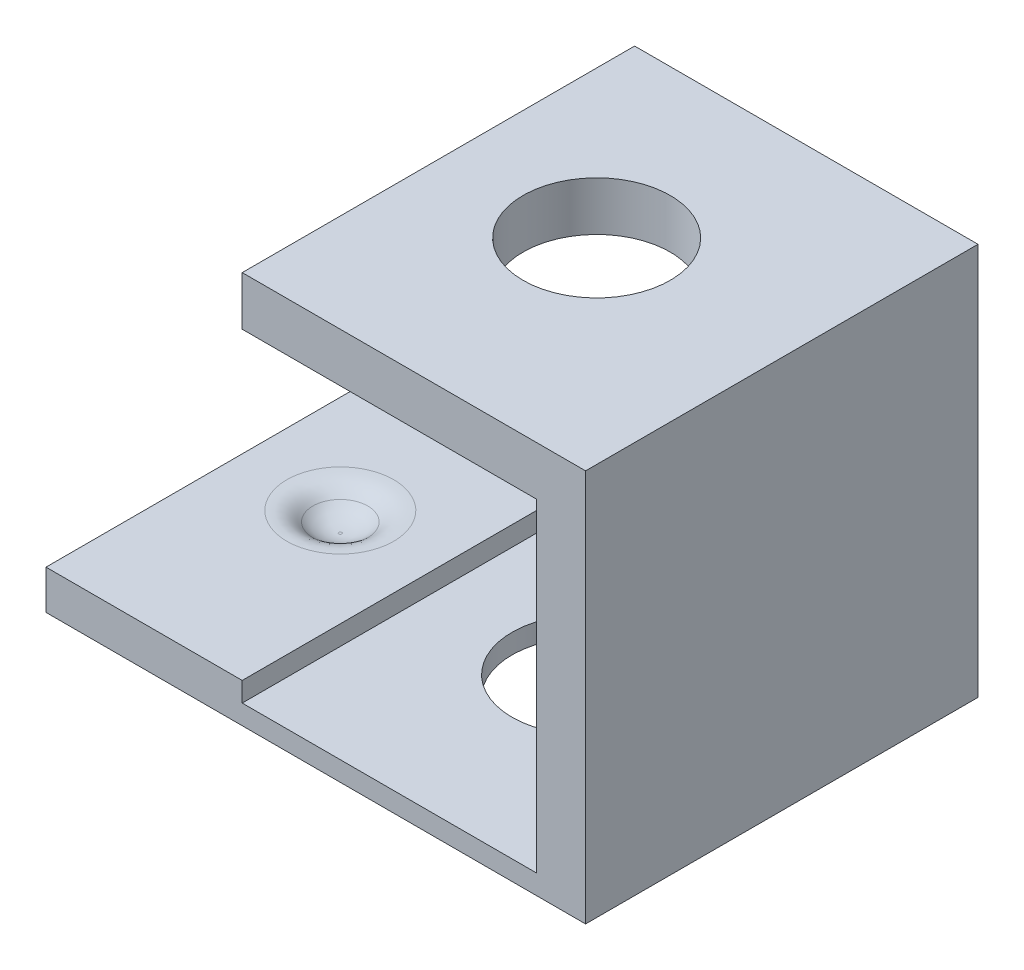
ISO-10303-21;
HEADER;
FILE_DESCRIPTION(('STEP AP214'),'2;1');
FILE_NAME('part.step','',(''),(''),'','','');
FILE_SCHEMA(('AUTOMOTIVE_DESIGN { 1 0 10303 214 1 1 1 1 }'));
ENDSEC;
DATA;
#1=APPLICATION_CONTEXT('core data for automotive mechanical design processes');
#2=APPLICATION_PROTOCOL_DEFINITION('international standard','automotive_design',2000,#1);
#3=PRODUCT_CONTEXT('',#1,'mechanical');
#4=PRODUCT('Part','Part','',(#3));
#5=PRODUCT_RELATED_PRODUCT_CATEGORY('part','',(#4));
#6=PRODUCT_DEFINITION_FORMATION('','',#4);
#7=PRODUCT_DEFINITION_CONTEXT('part definition',#1,'design');
#8=PRODUCT_DEFINITION('design','',#6,#7);
#9=PRODUCT_DEFINITION_SHAPE('','',#8);
#10=(LENGTH_UNIT() NAMED_UNIT(*) SI_UNIT(.MILLI.,.METRE.));
#11=(NAMED_UNIT(*) PLANE_ANGLE_UNIT() SI_UNIT($,.RADIAN.));
#12=(NAMED_UNIT(*) SI_UNIT($,.STERADIAN.) SOLID_ANGLE_UNIT());
#13=UNCERTAINTY_MEASURE_WITH_UNIT(LENGTH_MEASURE(1.E-05),#10,'distance_accuracy_value','');
#14=(GEOMETRIC_REPRESENTATION_CONTEXT(3) GLOBAL_UNCERTAINTY_ASSIGNED_CONTEXT((#13)) GLOBAL_UNIT_ASSIGNED_CONTEXT((#10,
#11,#12)) REPRESENTATION_CONTEXT('',''));
#15=CARTESIAN_POINT('',(0.,0.,0.));
#16=DIRECTION('',(0.,0.,1.));
#17=DIRECTION('',(1.,0.,0.));
#18=AXIS2_PLACEMENT_3D('',#15,#16,#17);
#19=CARTESIAN_POINT('',(31.75,25.4,0.));
#20=DIRECTION('',(-1.,0.,0.));
#21=DIRECTION('',(0.,0.,1.));
#22=AXIS2_PLACEMENT_3D('',#19,#20,#21);
#23=PLANE('',#22);
#24=DIRECTION('',(0.,-1.,0.));
#25=VECTOR('',#24,1.);
#26=CARTESIAN_POINT('',(31.75,25.4,0.));
#27=LINE('',#26,#25);
#28=CARTESIAN_POINT('',(31.75,22.225,0.));
#29=VERTEX_POINT('',#28);
#30=CARTESIAN_POINT('',(31.75,1.27,0.));
#31=VERTEX_POINT('',#30);
#32=EDGE_CURVE('E63',#29,#31,#27,.T.);
#33=ORIENTED_EDGE('',*,*,#32,.F.);
#34=DIRECTION('',(0.,0.,1.));
#35=VECTOR('',#34,1.);
#36=CARTESIAN_POINT('',(31.75,22.225,-25.4));
#37=LINE('',#36,#35);
#38=CARTESIAN_POINT('',(31.75,22.225,-25.4));
#39=VERTEX_POINT('',#38);
#40=EDGE_CURVE('E58',#39,#29,#37,.T.);
#41=ORIENTED_EDGE('',*,*,#40,.F.);
#42=DIRECTION('',(0.,-1.,0.));
#43=VECTOR('',#42,1.);
#44=CARTESIAN_POINT('',(31.75,25.4,-25.4));
#45=LINE('',#44,#43);
#46=CARTESIAN_POINT('',(31.75,1.27,-25.4));
#47=VERTEX_POINT('',#46);
#48=EDGE_CURVE('E142',#39,#47,#45,.T.);
#49=ORIENTED_EDGE('',*,*,#48,.T.);
#50=DIRECTION('',(0.,0.,-1.));
#51=VECTOR('',#50,1.);
#52=CARTESIAN_POINT('',(31.75,1.27,0.));
#53=LINE('',#52,#51);
#54=EDGE_CURVE('E177',#31,#47,#53,.T.);
#55=ORIENTED_EDGE('',*,*,#54,.F.);
#56=EDGE_LOOP('',(#33,#41,#49,#55));
#57=FACE_BOUND('',#56,.T.);
#58=ADVANCED_FACE('F37',(#57),#23,.T.);
#59=CARTESIAN_POINT('',(0.,1.27,0.));
#60=DIRECTION('',(0.,1.,0.));
#61=DIRECTION('',(0.,0.,1.));
#62=AXIS2_PLACEMENT_3D('',#59,#60,#61);
#63=PLANE('',#62);
#64=CARTESIAN_POINT('',(6.35,1.27,-12.7));
#65=DIRECTION('',(0.,1.,0.));
#66=DIRECTION('',(0.,0.,1.));
#67=AXIS2_PLACEMENT_3D('',#64,#65,#66);
#68=CIRCLE('',#67,0.0966130585606517);
#69=CARTESIAN_POINT('',(6.35,1.27,-12.6033869414393));
#70=VERTEX_POINT('',#69);
#71=EDGE_CURVE('E209',#70,#70,#68,.T.);
#72=ORIENTED_EDGE('',*,*,#71,.T.);
#73=EDGE_LOOP('',(#72));
#74=FACE_BOUND('',#73,.T.);
#75=ADVANCED_FACE('F236',(#74),#63,.T.);
#76=CARTESIAN_POINT('',(12.7,2.54,0.));
#77=DIRECTION('',(1.,0.,0.));
#78=DIRECTION('',(0.,0.,-1.));
#79=AXIS2_PLACEMENT_3D('',#76,#77,#78);
#80=PLANE('',#79);
#81=DIRECTION('',(0.,0.,1.));
#82=VECTOR('',#81,1.);
#83=CARTESIAN_POINT('',(12.7,1.27,0.));
#84=LINE('',#83,#82);
#85=CARTESIAN_POINT('',(12.7,1.27,-25.4));
#86=VERTEX_POINT('',#85);
#87=CARTESIAN_POINT('',(12.7,1.27,0.));
#88=VERTEX_POINT('',#87);
#89=EDGE_CURVE('E171',#86,#88,#84,.T.);
#90=ORIENTED_EDGE('',*,*,#89,.F.);
#91=DIRECTION('',(0.,-1.,0.));
#92=VECTOR('',#91,1.);
#93=CARTESIAN_POINT('',(12.7,2.54,-25.4));
#94=LINE('',#93,#92);
#95=CARTESIAN_POINT('',(12.7,2.54,-25.4));
#96=VERTEX_POINT('',#95);
#97=EDGE_CURVE('E206',#96,#86,#94,.T.);
#98=ORIENTED_EDGE('',*,*,#97,.F.);
#99=DIRECTION('',(0.,0.,1.));
#100=VECTOR('',#99,1.);
#101=CARTESIAN_POINT('',(12.7,2.54,0.));
#102=LINE('',#101,#100);
#103=CARTESIAN_POINT('',(12.7,2.54,0.));
#104=VERTEX_POINT('',#103);
#105=EDGE_CURVE('E183',#96,#104,#102,.T.);
#106=ORIENTED_EDGE('',*,*,#105,.T.);
#107=DIRECTION('',(0.,-1.,0.));
#108=VECTOR('',#107,1.);
#109=CARTESIAN_POINT('',(12.7,2.54,0.));
#110=LINE('',#109,#108);
#111=EDGE_CURVE('E195',#104,#88,#110,.T.);
#112=ORIENTED_EDGE('',*,*,#111,.T.);
#113=EDGE_LOOP('',(#90,#98,#106,#112));
#114=FACE_BOUND('',#113,.T.);
#115=ADVANCED_FACE('F239',(#114),#80,.T.);
#116=CARTESIAN_POINT('',(0.,2.54,-25.4));
#117=DIRECTION('',(0.,0.,-1.));
#118=DIRECTION('',(-1.,0.,0.));
#119=AXIS2_PLACEMENT_3D('',#116,#117,#118);
#120=PLANE('',#119);
#121=DIRECTION('',(1.,0.,0.));
#122=VECTOR('',#121,1.);
#123=CARTESIAN_POINT('',(0.,0.,-25.4));
#124=LINE('',#123,#122);
#125=CARTESIAN_POINT('',(0.,0.,-25.4));
#126=VERTEX_POINT('',#125);
#127=CARTESIAN_POINT('',(34.925,0.,-25.4));
#128=VERTEX_POINT('',#127);
#129=EDGE_CURVE('E180',#126,#128,#124,.T.);
#130=ORIENTED_EDGE('',*,*,#129,.F.);
#131=DIRECTION('',(0.,-1.,0.));
#132=VECTOR('',#131,1.);
#133=CARTESIAN_POINT('',(0.,2.54,-25.4));
#134=LINE('',#133,#132);
#135=CARTESIAN_POINT('',(0.,2.54,-25.4));
#136=VERTEX_POINT('',#135);
#137=EDGE_CURVE('E204',#136,#126,#134,.T.);
#138=ORIENTED_EDGE('',*,*,#137,.F.);
#139=DIRECTION('',(1.,0.,0.));
#140=VECTOR('',#139,1.);
#141=CARTESIAN_POINT('',(0.,2.54,-25.4));
#142=LINE('',#141,#140);
#143=EDGE_CURVE('E186',#136,#96,#142,.T.);
#144=ORIENTED_EDGE('',*,*,#143,.T.);
#145=ORIENTED_EDGE('',*,*,#97,.T.);
#146=DIRECTION('',(1.,0.,0.));
#147=VECTOR('',#146,1.);
#148=CARTESIAN_POINT('',(0.,1.27,-25.4));
#149=LINE('',#148,#147);
#150=EDGE_CURVE('E169',#86,#47,#149,.T.);
#151=ORIENTED_EDGE('',*,*,#150,.T.);
#152=ORIENTED_EDGE('',*,*,#48,.F.);
#153=DIRECTION('',(1.,0.,0.));
#154=VECTOR('',#153,1.);
#155=CARTESIAN_POINT('',(12.7,22.225,-25.4));
#156=LINE('',#155,#154);
#157=CARTESIAN_POINT('',(12.7,22.225,-25.4));
#158=VERTEX_POINT('',#157);
#159=EDGE_CURVE('E122',#158,#39,#156,.T.);
#160=ORIENTED_EDGE('',*,*,#159,.F.);
#161=DIRECTION('',(0.,-1.,0.));
#162=VECTOR('',#161,1.);
#163=CARTESIAN_POINT('',(12.7,25.4,-25.4));
#164=LINE('',#163,#162);
#165=CARTESIAN_POINT('',(12.7,25.4,-25.4));
#166=VERTEX_POINT('',#165);
#167=EDGE_CURVE('E129',#166,#158,#164,.T.);
#168=ORIENTED_EDGE('',*,*,#167,.F.);
#169=DIRECTION('',(1.,0.,0.));
#170=VECTOR('',#169,1.);
#171=CARTESIAN_POINT('',(0.,25.4,-25.4));
#172=LINE('',#171,#170);
#173=CARTESIAN_POINT('',(34.925,25.4,-25.4));
#174=VERTEX_POINT('',#173);
#175=EDGE_CURVE('E153',#166,#174,#172,.T.);
#176=ORIENTED_EDGE('',*,*,#175,.T.);
#177=DIRECTION('',(0.,-1.,0.));
#178=VECTOR('',#177,1.);
#179=CARTESIAN_POINT('',(34.925,25.4,-25.4));
#180=LINE('',#179,#178);
#181=EDGE_CURVE('E162',#174,#128,#180,.T.);
#182=ORIENTED_EDGE('',*,*,#181,.T.);
#183=EDGE_LOOP('',(#130,#138,#144,#145,#151,#152,#160,#168,#176,#182));
#184=FACE_BOUND('',#183,.T.);
#185=ADVANCED_FACE('F140',(#184),#120,.T.);
#186=CARTESIAN_POINT('',(0.,2.54,0.));
#187=DIRECTION('',(-1.,0.,0.));
#188=DIRECTION('',(0.,0.,1.));
#189=AXIS2_PLACEMENT_3D('',#186,#187,#188);
#190=PLANE('',#189);
#191=DIRECTION('',(0.,0.,-1.));
#192=VECTOR('',#191,1.);
#193=CARTESIAN_POINT('',(0.,0.,0.));
#194=LINE('',#193,#192);
#195=CARTESIAN_POINT('',(0.,0.,0.));
#196=VERTEX_POINT('',#195);
#197=EDGE_CURVE('E197',#196,#126,#194,.T.);
#198=ORIENTED_EDGE('',*,*,#197,.F.);
#199=DIRECTION('',(0.,-1.,0.));
#200=VECTOR('',#199,1.);
#201=CARTESIAN_POINT('',(0.,2.54,0.));
#202=LINE('',#201,#200);
#203=CARTESIAN_POINT('',(0.,2.54,0.));
#204=VERTEX_POINT('',#203);
#205=EDGE_CURVE('E202',#204,#196,#202,.T.);
#206=ORIENTED_EDGE('',*,*,#205,.F.);
#207=DIRECTION('',(0.,0.,-1.));
#208=VECTOR('',#207,1.);
#209=CARTESIAN_POINT('',(0.,2.54,0.));
#210=LINE('',#209,#208);
#211=EDGE_CURVE('E190',#204,#136,#210,.T.);
#212=ORIENTED_EDGE('',*,*,#211,.T.);
#213=ORIENTED_EDGE('',*,*,#137,.T.);
#214=EDGE_LOOP('',(#198,#206,#212,#213));
#215=FACE_BOUND('',#214,.T.);
#216=ADVANCED_FACE('F246',(#215),#190,.T.);
#217=CARTESIAN_POINT('',(0.,2.54,0.));
#218=DIRECTION('',(0.,0.,-1.));
#219=DIRECTION('',(-1.,0.,0.));
#220=AXIS2_PLACEMENT_3D('',#217,#218,#219);
#221=PLANE('',#220);
#222=DIRECTION('',(1.,0.,0.));
#223=VECTOR('',#222,1.);
#224=CARTESIAN_POINT('',(0.,0.,0.));
#225=LINE('',#224,#223);
#226=CARTESIAN_POINT('',(34.925,0.,0.));
#227=VERTEX_POINT('',#226);
#228=EDGE_CURVE('E187',#196,#227,#225,.T.);
#229=ORIENTED_EDGE('',*,*,#228,.T.);
#230=DIRECTION('',(0.,-1.,0.));
#231=VECTOR('',#230,1.);
#232=CARTESIAN_POINT('',(34.925,25.4,0.));
#233=LINE('',#232,#231);
#234=CARTESIAN_POINT('',(34.925,25.4,0.));
#235=VERTEX_POINT('',#234);
#236=EDGE_CURVE('E156',#235,#227,#233,.T.);
#237=ORIENTED_EDGE('',*,*,#236,.F.);
#238=DIRECTION('',(1.,0.,0.));
#239=VECTOR('',#238,1.);
#240=CARTESIAN_POINT('',(0.,25.4,0.));
#241=LINE('',#240,#239);
#242=CARTESIAN_POINT('',(12.7,25.4,0.));
#243=VERTEX_POINT('',#242);
#244=EDGE_CURVE('E155',#243,#235,#241,.T.);
#245=ORIENTED_EDGE('',*,*,#244,.F.);
#246=DIRECTION('',(0.,1.,0.));
#247=VECTOR('',#246,1.);
#248=CARTESIAN_POINT('',(12.7,25.4,0.));
#249=LINE('',#248,#247);
#250=CARTESIAN_POINT('',(12.7,22.225,0.));
#251=VERTEX_POINT('',#250);
#252=EDGE_CURVE('E128',#251,#243,#249,.T.);
#253=ORIENTED_EDGE('',*,*,#252,.F.);
#254=DIRECTION('',(1.,0.,0.));
#255=VECTOR('',#254,1.);
#256=CARTESIAN_POINT('',(12.7,22.225,0.));
#257=LINE('',#256,#255);
#258=EDGE_CURVE('E124',#251,#29,#257,.T.);
#259=ORIENTED_EDGE('',*,*,#258,.T.);
#260=ORIENTED_EDGE('',*,*,#32,.T.);
#261=DIRECTION('',(1.,0.,0.));
#262=VECTOR('',#261,1.);
#263=CARTESIAN_POINT('',(0.,1.27,0.));
#264=LINE('',#263,#262);
#265=EDGE_CURVE('E174',#88,#31,#264,.T.);
#266=ORIENTED_EDGE('',*,*,#265,.F.);
#267=ORIENTED_EDGE('',*,*,#111,.F.);
#268=DIRECTION('',(1.,0.,0.));
#269=VECTOR('',#268,1.);
#270=CARTESIAN_POINT('',(0.,2.54,0.));
#271=LINE('',#270,#269);
#272=EDGE_CURVE('E193',#204,#104,#271,.T.);
#273=ORIENTED_EDGE('',*,*,#272,.F.);
#274=ORIENTED_EDGE('',*,*,#205,.T.);
#275=EDGE_LOOP('',(#229,#237,#245,#253,#259,#260,#266,#267,#273,#274));
#276=FACE_BOUND('',#275,.T.);
#277=ADVANCED_FACE('F249',(#276),#221,.F.);
#278=CARTESIAN_POINT('',(0.,2.54,0.));
#279=DIRECTION('',(0.,1.,0.));
#280=DIRECTION('',(0.,0.,1.));
#281=AXIS2_PLACEMENT_3D('',#278,#279,#280);
#282=PLANE('',#281);
#283=CARTESIAN_POINT('',(6.35,2.54,-9.24328277638732));
#284=CARTESIAN_POINT('',(7.25290793346154,2.54,-9.24328277638732));
#285=CARTESIAN_POINT('',(9.05872380038461,2.54,-9.9912761996154));
#286=CARTESIAN_POINT('',(10.1807139352267,2.54,-12.7));
#287=CARTESIAN_POINT('',(9.05872380038461,2.54,-15.4087238003846));
#288=CARTESIAN_POINT('',(6.35,2.54,-16.5307139352267));
#289=CARTESIAN_POINT('',(3.64127619961538,2.54,-15.4087238003846));
#290=CARTESIAN_POINT('',(2.51928606477329,2.54,-12.7));
#291=CARTESIAN_POINT('',(3.64127619961537,2.54,-9.99127619961541));
#292=CARTESIAN_POINT('',(5.44709206653846,2.54,-9.24328277638732));
#293=CARTESIAN_POINT('',(6.35,2.54,-9.24328277638732));
#294=B_SPLINE_CURVE_WITH_KNOTS('',3,(#283,#284,#285,#286,#287,#288,#289,#290,#291,#292,#293),
.UNSPECIFIED.,.T.,.F.,(4,1,1,1,1,1,1,1,4),(0.,0.785398163397448,1.5707963267949,
2.35619449019234,3.14159265358979,3.92699081698724,4.71238898038469,5.49778714378214,
6.28318530717959),.UNSPECIFIED.);
#295=CARTESIAN_POINT('',(6.35,2.54,-9.24328277638732));
#296=VERTEX_POINT('',#295);
#297=EDGE_CURVE('E11',#296,#296,#294,.F.);
#298=ORIENTED_EDGE('',*,*,#297,.T.);
#299=EDGE_LOOP('',(#298));
#300=FACE_BOUND('',#299,.T.);
#301=ORIENTED_EDGE('',*,*,#105,.F.);
#302=ORIENTED_EDGE('',*,*,#143,.F.);
#303=ORIENTED_EDGE('',*,*,#211,.F.);
#304=ORIENTED_EDGE('',*,*,#272,.T.);
#305=EDGE_LOOP('',(#301,#302,#303,#304));
#306=FACE_BOUND('',#305,.T.);
#307=ADVANCED_FACE('F234',(#300,#306),#282,.T.);
#308=CARTESIAN_POINT('',(0.,0.,0.));
#309=DIRECTION('',(0.,1.,0.));
#310=DIRECTION('',(0.,0.,1.));
#311=AXIS2_PLACEMENT_3D('',#308,#309,#310);
#312=PLANE('',#311);
#313=ORIENTED_EDGE('',*,*,#129,.T.);
#314=DIRECTION('',(0.,0.,1.));
#315=VECTOR('',#314,1.);
#316=CARTESIAN_POINT('',(34.925,0.,0.));
#317=LINE('',#316,#315);
#318=EDGE_CURVE('E143',#128,#227,#317,.T.);
#319=ORIENTED_EDGE('',*,*,#318,.T.);
#320=ORIENTED_EDGE('',*,*,#228,.F.);
#321=ORIENTED_EDGE('',*,*,#197,.T.);
#322=EDGE_LOOP('',(#313,#319,#320,#321));
#323=FACE_BOUND('',#322,.T.);
#324=CARTESIAN_POINT('',(22.225,0.,-12.7));
#325=DIRECTION('',(0.,1.,0.));
#326=DIRECTION('',(0.,0.,1.));
#327=AXIS2_PLACEMENT_3D('',#324,#325,#326);
#328=CIRCLE('',#327,4.7625);
#329=CARTESIAN_POINT('',(22.225,0.,-7.9375));
#330=VERTEX_POINT('',#329);
#331=EDGE_CURVE('E165',#330,#330,#328,.T.);
#332=ORIENTED_EDGE('',*,*,#331,.T.);
#333=EDGE_LOOP('',(#332));
#334=FACE_BOUND('',#333,.T.);
#335=ADVANCED_FACE('F230',(#323,#334),#312,.F.);
#336=CARTESIAN_POINT('',(22.225,1.27,-12.7));
#337=DIRECTION('',(0.,-1.,0.));
#338=DIRECTION('',(0.,0.,-1.));
#339=AXIS2_PLACEMENT_3D('',#336,#337,#338);
#340=CYLINDRICAL_SURFACE('',#339,4.7625);
#341=CARTESIAN_POINT('',(22.225,1.27,-12.7));
#342=DIRECTION('',(0.,1.,0.));
#343=DIRECTION('',(0.,0.,1.));
#344=AXIS2_PLACEMENT_3D('',#341,#342,#343);
#345=CIRCLE('',#344,4.7625);
#346=CARTESIAN_POINT('',(22.225,1.27,-7.9375));
#347=VERTEX_POINT('',#346);
#348=EDGE_CURVE('E166',#347,#347,#345,.T.);
#349=ORIENTED_EDGE('',*,*,#348,.T.);
#350=EDGE_LOOP('',(#349));
#351=FACE_BOUND('',#350,.T.);
#352=ORIENTED_EDGE('',*,*,#331,.F.);
#353=EDGE_LOOP('',(#352));
#354=FACE_BOUND('',#353,.T.);
#355=ADVANCED_FACE('F233',(#351,#354),#340,.F.);
#356=CARTESIAN_POINT('',(0.,1.27,0.));
#357=DIRECTION('',(0.,1.,0.));
#358=DIRECTION('',(0.,0.,1.));
#359=AXIS2_PLACEMENT_3D('',#356,#357,#358);
#360=PLANE('',#359);
#361=ORIENTED_EDGE('',*,*,#348,.F.);
#362=EDGE_LOOP('',(#361));
#363=FACE_BOUND('',#362,.T.);
#364=ORIENTED_EDGE('',*,*,#150,.F.);
#365=ORIENTED_EDGE('',*,*,#89,.T.);
#366=ORIENTED_EDGE('',*,*,#265,.T.);
#367=ORIENTED_EDGE('',*,*,#54,.T.);
#368=EDGE_LOOP('',(#364,#365,#366,#367));
#369=FACE_BOUND('',#368,.T.);
#370=ADVANCED_FACE('F289',(#363,#369),#360,.T.);
#371=CARTESIAN_POINT('',(34.925,25.4,0.));
#372=DIRECTION('',(1.,0.,0.));
#373=DIRECTION('',(0.,0.,-1.));
#374=AXIS2_PLACEMENT_3D('',#371,#372,#373);
#375=PLANE('',#374);
#376=ORIENTED_EDGE('',*,*,#318,.F.);
#377=ORIENTED_EDGE('',*,*,#181,.F.);
#378=DIRECTION('',(0.,0.,1.));
#379=VECTOR('',#378,1.);
#380=CARTESIAN_POINT('',(34.925,25.4,0.));
#381=LINE('',#380,#379);
#382=EDGE_CURVE('E146',#174,#235,#381,.T.);
#383=ORIENTED_EDGE('',*,*,#382,.T.);
#384=ORIENTED_EDGE('',*,*,#236,.T.);
#385=EDGE_LOOP('',(#376,#377,#383,#384));
#386=FACE_BOUND('',#385,.T.);
#387=ADVANCED_FACE('F298',(#386),#375,.T.);
#388=CARTESIAN_POINT('',(0.,25.4,0.));
#389=DIRECTION('',(0.,1.,0.));
#390=DIRECTION('',(0.,0.,1.));
#391=AXIS2_PLACEMENT_3D('',#388,#389,#390);
#392=PLANE('',#391);
#393=CARTESIAN_POINT('',(22.225,25.4,-13.4163802721682));
#394=DIRECTION('',(0.,1.,0.));
#395=DIRECTION('',(0.,0.,1.));
#396=AXIS2_PLACEMENT_3D('',#393,#394,#395);
#397=CIRCLE('',#396,4.7625);
#398=CARTESIAN_POINT('',(22.225,25.4,-8.65388027216818));
#399=VERTEX_POINT('',#398);
#400=EDGE_CURVE('E453',#399,#399,#397,.T.);
#401=ORIENTED_EDGE('',*,*,#400,.F.);
#402=EDGE_LOOP('',(#401));
#403=FACE_BOUND('',#402,.T.);
#404=ORIENTED_EDGE('',*,*,#382,.F.);
#405=ORIENTED_EDGE('',*,*,#175,.F.);
#406=DIRECTION('',(0.,0.,-1.));
#407=VECTOR('',#406,1.);
#408=CARTESIAN_POINT('',(12.7,25.4,-25.4));
#409=LINE('',#408,#407);
#410=EDGE_CURVE('E135',#243,#166,#409,.T.);
#411=ORIENTED_EDGE('',*,*,#410,.F.);
#412=ORIENTED_EDGE('',*,*,#244,.T.);
#413=EDGE_LOOP('',(#404,#405,#411,#412));
#414=FACE_BOUND('',#413,.T.);
#415=ADVANCED_FACE('F296',(#403,#414),#392,.T.);
#416=CARTESIAN_POINT('',(12.7,22.225,-25.4));
#417=DIRECTION('',(0.,1.,0.));
#418=DIRECTION('',(0.,0.,1.));
#419=AXIS2_PLACEMENT_3D('',#416,#417,#418);
#420=PLANE('',#419);
#421=CARTESIAN_POINT('',(22.225,22.225,-13.4163802721682));
#422=DIRECTION('',(0.,1.,0.));
#423=DIRECTION('',(0.,0.,1.));
#424=AXIS2_PLACEMENT_3D('',#421,#422,#423);
#425=CIRCLE('',#424,4.7625);
#426=CARTESIAN_POINT('',(22.225,22.225,-8.65388027216818));
#427=VERTEX_POINT('',#426);
#428=EDGE_CURVE('E459',#427,#427,#425,.T.);
#429=ORIENTED_EDGE('',*,*,#428,.T.);
#430=EDGE_LOOP('',(#429));
#431=FACE_BOUND('',#430,.T.);
#432=ORIENTED_EDGE('',*,*,#40,.T.);
#433=ORIENTED_EDGE('',*,*,#258,.F.);
#434=DIRECTION('',(0.,0.,1.));
#435=VECTOR('',#434,1.);
#436=CARTESIAN_POINT('',(12.7,22.225,-25.4));
#437=LINE('',#436,#435);
#438=EDGE_CURVE('E118',#158,#251,#437,.T.);
#439=ORIENTED_EDGE('',*,*,#438,.F.);
#440=ORIENTED_EDGE('',*,*,#159,.T.);
#441=EDGE_LOOP('',(#432,#433,#439,#440));
#442=FACE_BOUND('',#441,.T.);
#443=ADVANCED_FACE('F120',(#431,#442),#420,.F.);
#444=CARTESIAN_POINT('',(12.7,0.,0.));
#445=DIRECTION('',(-1.,0.,0.));
#446=DIRECTION('',(0.,0.,1.));
#447=AXIS2_PLACEMENT_3D('',#444,#445,#446);
#448=PLANE('',#447);
#449=ORIENTED_EDGE('',*,*,#167,.T.);
#450=ORIENTED_EDGE('',*,*,#438,.T.);
#451=ORIENTED_EDGE('',*,*,#252,.T.);
#452=ORIENTED_EDGE('',*,*,#410,.T.);
#453=EDGE_LOOP('',(#449,#450,#451,#452));
#454=FACE_BOUND('',#453,.T.);
#455=ADVANCED_FACE('F133',(#454),#448,.T.);
#456=CARTESIAN_POINT('',(22.225,22.225,-13.4163802721682));
#457=DIRECTION('',(0.,1.,0.));
#458=DIRECTION('',(0.,0.,1.));
#459=AXIS2_PLACEMENT_3D('',#456,#457,#458);
#460=CYLINDRICAL_SURFACE('',#459,4.7625);
#461=ORIENTED_EDGE('',*,*,#428,.F.);
#462=EDGE_LOOP('',(#461));
#463=FACE_BOUND('',#462,.T.);
#464=ORIENTED_EDGE('',*,*,#400,.T.);
#465=EDGE_LOOP('',(#464));
#466=FACE_BOUND('',#465,.T.);
#467=ADVANCED_FACE('F229',(#463,#466),#460,.F.);
#468=CARTESIAN_POINT('',(6.35,3.81,-12.7));
#469=DIRECTION('',(0.,-1.,0.));
#470=DIRECTION('',(0.,0.,-1.));
#471=AXIS2_PLACEMENT_3D('',#468,#469,#470);
#472=DEGENERATE_TOROIDAL_SURFACE('',#471,0.0966130585606517,2.54,.T.);
#473=CARTESIAN_POINT('',(6.35,1.905,-10.9233348589133));
#474=CARTESIAN_POINT('',(5.88592818063516,1.905,-10.9233348589133));
#475=CARTESIAN_POINT('',(4.95778454190547,1.905,-11.3077845419055));
#476=CARTESIAN_POINT('',(4.38111001741726,1.905,-12.7));
#477=CARTESIAN_POINT('',(4.95778454190548,1.905,-14.0922154580945));
#478=CARTESIAN_POINT('',(6.35,1.905,-14.6688899825827));
#479=CARTESIAN_POINT('',(7.74221545809452,1.905,-14.0922154580945));
#480=CARTESIAN_POINT('',(8.31888998258274,1.905,-12.7));
#481=CARTESIAN_POINT('',(7.74221545809452,1.905,-11.3077845419055));
#482=CARTESIAN_POINT('',(6.81407181936484,1.905,-10.9233348589133));
#483=CARTESIAN_POINT('',(6.35,1.905,-10.9233348589133));
#484=B_SPLINE_CURVE_WITH_KNOTS('',3,(#473,#474,#475,#476,#477,#478,#479,#480,#481,#482,#483),
.UNSPECIFIED.,.T.,.F.,(4,1,1,1,1,1,1,1,4),(0.,0.785398163397448,1.5707963267949,
2.35619449019235,3.14159265358979,3.92699081698724,4.71238898038469,5.49778714378214,
6.28318530717959),.UNSPECIFIED.);
#485=CARTESIAN_POINT('',(6.35,1.905,-10.9233348589133));
#486=VERTEX_POINT('',#485);
#487=EDGE_CURVE('E51',#486,#486,#484,.F.);
#488=ORIENTED_EDGE('',*,*,#487,.T.);
#489=EDGE_LOOP('',(#488));
#490=FACE_BOUND('',#489,.T.);
#491=ORIENTED_EDGE('',*,*,#71,.F.);
#492=EDGE_LOOP('',(#491));
#493=FACE_BOUND('',#492,.T.);
#494=ADVANCED_FACE('F220',(#490,#493),#472,.F.);
#495=CARTESIAN_POINT('',(6.35,1.905,-10.9233348589133));
#496=CARTESIAN_POINT('',(6.81407181936484,1.905,-10.9233348589133));
#497=CARTESIAN_POINT('',(7.74221545809452,1.905,-11.3077845419055));
#498=CARTESIAN_POINT('',(8.31888998258274,1.905,-12.7));
#499=CARTESIAN_POINT('',(7.74221545809452,1.905,-14.0922154580945));
#500=CARTESIAN_POINT('',(6.35,1.905,-14.6688899825827));
#501=CARTESIAN_POINT('',(4.95778454190548,1.905,-14.0922154580945));
#502=CARTESIAN_POINT('',(4.38111001741726,1.905,-12.7));
#503=CARTESIAN_POINT('',(4.95778454190547,1.905,-11.3077845419055));
#504=CARTESIAN_POINT('',(5.88592818063516,1.905,-10.9233348589133));
#505=CARTESIAN_POINT('',(6.35,1.905,-10.9233348589133));
#506=CARTESIAN_POINT('',(6.35,1.98803359484573,-10.8291836121595));
#507=CARTESIAN_POINT('',(6.8386644898496,1.98803359484573,-10.8291836121595));
#508=CARTESIAN_POINT('',(7.81599346954879,1.98803359484573,-11.2340065304512));
#509=CARTESIAN_POINT('',(8.42322784698628,1.98803359484573,-12.7));
#510=CARTESIAN_POINT('',(7.81599346954878,1.98803359484573,-14.1659934695488));
#511=CARTESIAN_POINT('',(6.35,1.98803359484573,-14.7732278469863));
#512=CARTESIAN_POINT('',(4.88400653045121,1.98803359484573,-14.1659934695488));
#513=CARTESIAN_POINT('',(4.27677215301372,1.98803359484573,-12.7));
#514=CARTESIAN_POINT('',(4.8840065304512,1.98803359484573,-11.2340065304512));
#515=CARTESIAN_POINT('',(5.8613355101504,1.98803359484573,-10.8291836121596));
#516=CARTESIAN_POINT('',(6.35,1.98803359484573,-10.8291836121595));
#517=CARTESIAN_POINT('',(6.35,2.09695676243809,-10.7174014583241));
#518=CARTESIAN_POINT('',(6.86786242158322,2.09695676243809,-10.717401458324));
#519=CARTESIAN_POINT('',(7.90358726474966,2.09695676243809,-11.1464127352503));
#520=CARTESIAN_POINT('',(8.54710418013909,2.09695676243809,-12.7));
#521=CARTESIAN_POINT('',(7.90358726474966,2.09695676243809,-14.2535872647497));
#522=CARTESIAN_POINT('',(6.35,2.09695676243809,-14.8971041801391));
#523=CARTESIAN_POINT('',(4.79641273525034,2.09695676243809,-14.2535872647497));
#524=CARTESIAN_POINT('',(4.15289581986091,2.09695676243809,-12.7));
#525=CARTESIAN_POINT('',(4.79641273525033,2.09695676243809,-11.1464127352503));
#526=CARTESIAN_POINT('',(5.83213757841678,2.09695676243809,-10.7174014583241));
#527=CARTESIAN_POINT('',(6.35,2.09695676243809,-10.7174014583241));
#528=CARTESIAN_POINT('',(6.35,2.38716744174309,-10.3479562078868));
#529=CARTESIAN_POINT('',(6.96436295258438,2.38716744174309,-10.3479562078868));
#530=CARTESIAN_POINT('',(8.19308885775313,2.3871674417431,-10.8569111422469));
#531=CARTESIAN_POINT('',(8.95652125929321,2.38716744174309,-12.7));
#532=CARTESIAN_POINT('',(8.19308885775313,2.38716744174309,-14.5430888577531));
#533=CARTESIAN_POINT('',(6.35,2.3871674417431,-15.3065212592932));
#534=CARTESIAN_POINT('',(4.50691114224687,2.38716744174309,-14.5430888577531));
#535=CARTESIAN_POINT('',(3.74347874070679,2.38716744174309,-12.7));
#536=CARTESIAN_POINT('',(4.50691114224686,2.38716744174309,-10.8569111422469));
#537=CARTESIAN_POINT('',(5.73563704741562,2.38716744174309,-10.3479562078868));
#538=CARTESIAN_POINT('',(6.35,2.38716744174309,-10.3479562078868));
#539=CARTESIAN_POINT('',(6.35,2.51241851864712,-9.96570654300017));
#540=CARTESIAN_POINT('',(7.06420804625636,2.51241851864712,-9.96570654300017));
#541=CARTESIAN_POINT('',(8.49262413876908,2.51241851864712,-10.5573758612309));
#542=CARTESIAN_POINT('',(9.3801281161152,2.51241851864712,-12.7));
#543=CARTESIAN_POINT('',(8.49262413876907,2.51241851864712,-14.8426241387691));
#544=CARTESIAN_POINT('',(6.35,2.51241851864711,-15.7301281161152));
#545=CARTESIAN_POINT('',(4.20737586123092,2.51241851864712,-14.8426241387691));
#546=CARTESIAN_POINT('',(3.31987188388479,2.51241851864711,-12.7));
#547=CARTESIAN_POINT('',(4.20737586123091,2.51241851864712,-10.5573758612309));
#548=CARTESIAN_POINT('',(5.63579195374364,2.51241851864712,-9.96570654300017));
#549=CARTESIAN_POINT('',(6.35,2.51241851864712,-9.96570654300017));
#550=CARTESIAN_POINT('',(6.35,2.54,-9.5960856956419));
#551=CARTESIAN_POINT('',(7.16075444385372,2.54,-9.5960856956419));
#552=CARTESIAN_POINT('',(8.78226333156116,2.54,-10.2677366684388));
#553=CARTESIAN_POINT('',(9.78973979075657,2.54,-12.7));
#554=CARTESIAN_POINT('',(8.78226333156116,2.54,-15.1322633315612));
#555=CARTESIAN_POINT('',(6.35,2.54,-16.1397397907566));
#556=CARTESIAN_POINT('',(3.91773666843883,2.54,-15.1322633315612));
#557=CARTESIAN_POINT('',(2.91026020924344,2.54,-12.7));
#558=CARTESIAN_POINT('',(3.91773666843882,2.54,-10.2677366684389));
#559=CARTESIAN_POINT('',(5.53924555614628,2.54,-9.59608569564191));
#560=CARTESIAN_POINT('',(6.35,2.54,-9.5960856956419));
#561=CARTESIAN_POINT('',(6.35,2.54,-9.41968423601461));
#562=CARTESIAN_POINT('',(7.20683118865763,2.54,-9.41968423601461));
#563=CARTESIAN_POINT('',(8.92049356597289,2.54,-10.1295064340271));
#564=CARTESIAN_POINT('',(9.98522686299164,2.54,-12.7));
#565=CARTESIAN_POINT('',(8.92049356597288,2.54,-15.2704935659729));
#566=CARTESIAN_POINT('',(6.35,2.54,-16.3352268629916));
#567=CARTESIAN_POINT('',(3.77950643402711,2.54,-15.2704935659729));
#568=CARTESIAN_POINT('',(2.71477313700836,2.54,-12.7));
#569=CARTESIAN_POINT('',(3.7795064340271,2.54,-10.1295064340271));
#570=CARTESIAN_POINT('',(5.49316881134237,2.54,-9.41968423601461));
#571=CARTESIAN_POINT('',(6.35,2.54,-9.41968423601461));
#572=CARTESIAN_POINT('',(6.35,2.54,-9.24328277638732));
#573=CARTESIAN_POINT('',(7.25290793346154,2.54,-9.24328277638732));
#574=CARTESIAN_POINT('',(9.05872380038461,2.54,-9.99127619961539));
#575=CARTESIAN_POINT('',(10.1807139352267,2.54,-12.7));
#576=CARTESIAN_POINT('',(9.05872380038461,2.54,-15.4087238003846));
#577=CARTESIAN_POINT('',(6.35,2.54,-16.5307139352267));
#578=CARTESIAN_POINT('',(3.64127619961538,2.54,-15.4087238003846));
#579=CARTESIAN_POINT('',(2.51928606477329,2.54,-12.7));
#580=CARTESIAN_POINT('',(3.64127619961537,2.54,-9.9912761996154));
#581=CARTESIAN_POINT('',(5.44709206653846,2.54,-9.24328277638732));
#582=CARTESIAN_POINT('',(6.35,2.54,-9.24328277638732));
#583=B_SPLINE_SURFACE_WITH_KNOTS('',5,3,((#495,#496,#497,#498,#499,#500,#501,#502,#503,#504,
#505),(#506,#507,#508,#509,#510,#511,#512,#513,#514,#515,#516),(#517,#518,#519,#520,#521,#522,
#523,#524,#525,#526,#527),(#528,#529,#530,#531,#532,#533,#534,#535,#536,#537,#538),(#539,#540,
#541,#542,#543,#544,#545,#546,#547,#548,#549),(#550,#551,#552,#553,#554,#555,#556,#557,#558,
#559,#560),(#561,#562,#563,#564,#565,#566,#567,#568,#569,#570,#571),(#572,#573,#574,#575,#576,
#577,#578,#579,#580,#581,#582)),.UNSPECIFIED.,.F.,.T.,.F.,(6,2,6),(4,1,1,1,1,1,1,1,4),(0.,0.5,
1.),(0.,0.785398163397448,1.5707963267949,2.35619449019234,3.14159265358979,3.92699081698724,
4.71238898038469,5.49778714378214,6.28318530717959),.UNSPECIFIED.);
#584=ORIENTED_EDGE('',*,*,#297,.F.);
#585=EDGE_LOOP('',(#584));
#586=FACE_BOUND('',#585,.T.);
#587=ORIENTED_EDGE('',*,*,#487,.F.);
#588=EDGE_LOOP('',(#587));
#589=FACE_BOUND('',#588,.T.);
#590=ADVANCED_FACE('F40',(#586,#589),#583,.T.);
#591=CLOSED_SHELL('',(#58,#75,#115,#185,#216,#277,#307,#335,#355,#370,#387,#415,#443,#455,#467,
#494,#590));
#592=MANIFOLD_SOLID_BREP('B2',#591);
#593=ADVANCED_BREP_SHAPE_REPRESENTATION('',(#18,#592),#14);
#594=SHAPE_DEFINITION_REPRESENTATION(#9,#593);
ENDSEC;
END-ISO-10303-21;
